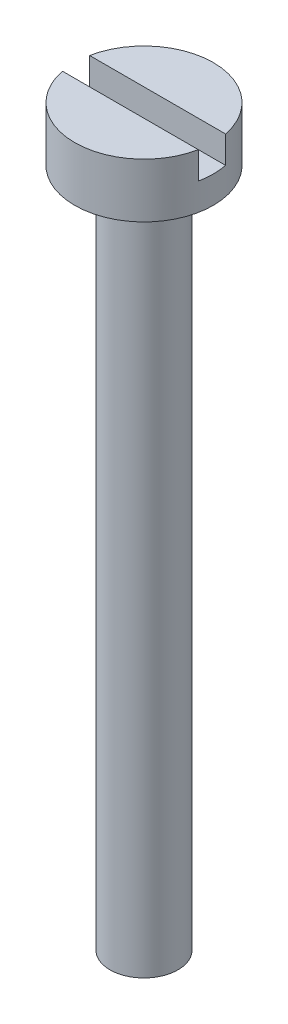
ISO-10303-21;
HEADER;
FILE_DESCRIPTION(('STEP AP214'),'2;1');
FILE_NAME('part.step','',(''),(''),'','','');
FILE_SCHEMA(('AUTOMOTIVE_DESIGN { 1 0 10303 214 1 1 1 1 }'));
ENDSEC;
DATA;
#1=APPLICATION_CONTEXT('core data for automotive mechanical design processes');
#2=APPLICATION_PROTOCOL_DEFINITION('international standard','automotive_design',2000,#1);
#3=PRODUCT_CONTEXT('',#1,'mechanical');
#4=PRODUCT('Part','Part','',(#3));
#5=PRODUCT_RELATED_PRODUCT_CATEGORY('part','',(#4));
#6=PRODUCT_DEFINITION_FORMATION('','',#4);
#7=PRODUCT_DEFINITION_CONTEXT('part definition',#1,'design');
#8=PRODUCT_DEFINITION('design','',#6,#7);
#9=PRODUCT_DEFINITION_SHAPE('','',#8);
#10=(LENGTH_UNIT() NAMED_UNIT(*) SI_UNIT(.MILLI.,.METRE.));
#11=(NAMED_UNIT(*) PLANE_ANGLE_UNIT() SI_UNIT($,.RADIAN.));
#12=(NAMED_UNIT(*) SI_UNIT($,.STERADIAN.) SOLID_ANGLE_UNIT());
#13=UNCERTAINTY_MEASURE_WITH_UNIT(LENGTH_MEASURE(1.E-05),#10,'distance_accuracy_value','');
#14=(GEOMETRIC_REPRESENTATION_CONTEXT(3) GLOBAL_UNCERTAINTY_ASSIGNED_CONTEXT((#13)) GLOBAL_UNIT_ASSIGNED_CONTEXT((#10,
#11,#12)) REPRESENTATION_CONTEXT('',''));
#15=CARTESIAN_POINT('',(0.,0.,0.));
#16=DIRECTION('',(0.,0.,1.));
#17=DIRECTION('',(1.,0.,0.));
#18=AXIS2_PLACEMENT_3D('',#15,#16,#17);
#19=CARTESIAN_POINT('',(0.,2.,0.));
#20=DIRECTION('',(0.,1.,0.));
#21=DIRECTION('',(0.,0.,1.));
#22=AXIS2_PLACEMENT_3D('',#19,#20,#21);
#23=PLANE('',#22);
#24=DIRECTION('',(1.,0.,0.));
#25=VECTOR('',#24,1.);
#26=CARTESIAN_POINT('',(0.,2.,0.5));
#27=LINE('',#26,#25);
#28=CARTESIAN_POINT('',(-2.50049995001,2.,0.5));
#29=VERTEX_POINT('',#28);
#30=CARTESIAN_POINT('',(2.50049995001,2.,0.5));
#31=VERTEX_POINT('',#30);
#32=EDGE_CURVE('E83',#29,#31,#27,.T.);
#33=ORIENTED_EDGE('',*,*,#32,.F.);
#34=CARTESIAN_POINT('',(0.,2.,0.));
#35=DIRECTION('',(0.,1.,0.));
#36=DIRECTION('',(0.,0.,1.));
#37=AXIS2_PLACEMENT_3D('',#34,#35,#36);
#38=CIRCLE('',#37,2.55);
#39=EDGE_CURVE('E93',#29,#31,#38,.T.);
#40=ORIENTED_EDGE('',*,*,#39,.T.);
#41=EDGE_LOOP('',(#33,#40));
#42=FACE_BOUND('',#41,.T.);
#43=ADVANCED_FACE('F35',(#42),#23,.T.);
#44=CARTESIAN_POINT('',(0.,2.,0.));
#45=DIRECTION('',(0.,-1.,0.));
#46=DIRECTION('',(0.,0.,-1.));
#47=AXIS2_PLACEMENT_3D('',#44,#45,#46);
#48=CYLINDRICAL_SURFACE('',#47,2.55);
#49=CARTESIAN_POINT('',(0.,1.,0.));
#50=DIRECTION('',(0.,-1.,0.));
#51=DIRECTION('',(0.,0.,-1.));
#52=AXIS2_PLACEMENT_3D('',#49,#50,#51);
#53=CIRCLE('',#52,2.55);
#54=CARTESIAN_POINT('',(2.50049995001,1.,-0.5));
#55=VERTEX_POINT('',#54);
#56=CARTESIAN_POINT('',(2.50049995001,1.,0.5));
#57=VERTEX_POINT('',#56);
#58=EDGE_CURVE('E11',#55,#57,#53,.T.);
#59=ORIENTED_EDGE('',*,*,#58,.T.);
#60=DIRECTION('',(0.,-1.,0.));
#61=VECTOR('',#60,1.);
#62=CARTESIAN_POINT('',(2.50049995001,2.,0.5));
#63=LINE('',#62,#61);
#64=EDGE_CURVE('E58',#57,#31,#63,.F.);
#65=ORIENTED_EDGE('',*,*,#64,.T.);
#66=ORIENTED_EDGE('',*,*,#39,.F.);
#67=DIRECTION('',(0.,-1.,0.));
#68=VECTOR('',#67,1.);
#69=CARTESIAN_POINT('',(-2.50049995001,2.,0.5));
#70=LINE('',#69,#68);
#71=CARTESIAN_POINT('',(-2.50049995001,1.,0.5));
#72=VERTEX_POINT('',#71);
#73=EDGE_CURVE('E105',#29,#72,#70,.T.);
#74=ORIENTED_EDGE('',*,*,#73,.T.);
#75=CARTESIAN_POINT('',(-2.50049995001,1.,-0.5));
#76=VERTEX_POINT('',#75);
#77=EDGE_CURVE('E39',#72,#76,#53,.T.);
#78=ORIENTED_EDGE('',*,*,#77,.T.);
#79=DIRECTION('',(0.,-1.,0.));
#80=VECTOR('',#79,1.);
#81=CARTESIAN_POINT('',(-2.50049995001,2.,-0.5));
#82=LINE('',#81,#80);
#83=CARTESIAN_POINT('',(-2.50049995001,2.,-0.5));
#84=VERTEX_POINT('',#83);
#85=EDGE_CURVE('E78',#76,#84,#82,.F.);
#86=ORIENTED_EDGE('',*,*,#85,.T.);
#87=CARTESIAN_POINT('',(2.50049995001,2.,-0.5));
#88=VERTEX_POINT('',#87);
#89=EDGE_CURVE('E84',#88,#84,#38,.T.);
#90=ORIENTED_EDGE('',*,*,#89,.F.);
#91=DIRECTION('',(0.,-1.,0.));
#92=VECTOR('',#91,1.);
#93=CARTESIAN_POINT('',(2.50049995001,2.,-0.5));
#94=LINE('',#93,#92);
#95=EDGE_CURVE('E50',#88,#55,#94,.T.);
#96=ORIENTED_EDGE('',*,*,#95,.T.);
#97=EDGE_LOOP('',(#59,#65,#66,#74,#78,#86,#90,#96));
#98=FACE_BOUND('',#97,.T.);
#99=CARTESIAN_POINT('',(0.,0.,0.));
#100=DIRECTION('',(0.,1.,0.));
#101=DIRECTION('',(0.,0.,1.));
#102=AXIS2_PLACEMENT_3D('',#99,#100,#101);
#103=CIRCLE('',#102,2.55);
#104=CARTESIAN_POINT('',(0.,0.,2.55));
#105=VERTEX_POINT('',#104);
#106=EDGE_CURVE('E96',#105,#105,#103,.T.);
#107=ORIENTED_EDGE('',*,*,#106,.T.);
#108=EDGE_LOOP('',(#107));
#109=FACE_BOUND('',#108,.T.);
#110=ADVANCED_FACE('F37',(#98,#109),#48,.T.);
#111=DIRECTION('',(-1.,0.,0.));
#112=VECTOR('',#111,1.);
#113=CARTESIAN_POINT('',(0.,2.,-0.5));
#114=LINE('',#113,#112);
#115=EDGE_CURVE('E75',#88,#84,#114,.T.);
#116=ORIENTED_EDGE('',*,*,#115,.F.);
#117=ORIENTED_EDGE('',*,*,#89,.T.);
#118=EDGE_LOOP('',(#116,#117));
#119=FACE_BOUND('',#118,.T.);
#120=ADVANCED_FACE('F92',(#119),#23,.T.);
#121=CARTESIAN_POINT('',(0.,0.,0.));
#122=DIRECTION('',(0.,1.,0.));
#123=DIRECTION('',(0.,0.,1.));
#124=AXIS2_PLACEMENT_3D('',#121,#122,#123);
#125=PLANE('',#124);
#126=CARTESIAN_POINT('',(0.,0.,0.));
#127=DIRECTION('',(0.,1.,0.));
#128=DIRECTION('',(0.,0.,1.));
#129=AXIS2_PLACEMENT_3D('',#126,#127,#128);
#130=CIRCLE('',#129,1.25);
#131=CARTESIAN_POINT('',(0.,0.,1.25));
#132=VERTEX_POINT('',#131);
#133=EDGE_CURVE('E99',#132,#132,#130,.T.);
#134=ORIENTED_EDGE('',*,*,#133,.T.);
#135=EDGE_LOOP('',(#134));
#136=FACE_BOUND('',#135,.T.);
#137=ORIENTED_EDGE('',*,*,#106,.F.);
#138=EDGE_LOOP('',(#137));
#139=FACE_BOUND('',#138,.T.);
#140=ADVANCED_FACE('F116',(#136,#139),#125,.F.);
#141=CARTESIAN_POINT('',(0.,-25.,0.));
#142=DIRECTION('',(0.,1.,0.));
#143=DIRECTION('',(0.,0.,1.));
#144=AXIS2_PLACEMENT_3D('',#141,#142,#143);
#145=CYLINDRICAL_SURFACE('',#144,1.25);
#146=CARTESIAN_POINT('',(0.,-25.,0.));
#147=DIRECTION('',(0.,1.,0.));
#148=DIRECTION('',(0.,0.,1.));
#149=AXIS2_PLACEMENT_3D('',#146,#147,#148);
#150=CIRCLE('',#149,1.25);
#151=CARTESIAN_POINT('',(0.,-25.,1.25));
#152=VERTEX_POINT('',#151);
#153=EDGE_CURVE('E102',#152,#152,#150,.T.);
#154=ORIENTED_EDGE('',*,*,#153,.T.);
#155=EDGE_LOOP('',(#154));
#156=FACE_BOUND('',#155,.T.);
#157=ORIENTED_EDGE('',*,*,#133,.F.);
#158=EDGE_LOOP('',(#157));
#159=FACE_BOUND('',#158,.T.);
#160=ADVANCED_FACE('F120',(#156,#159),#145,.T.);
#161=CARTESIAN_POINT('',(0.,-25.,0.));
#162=DIRECTION('',(0.,1.,0.));
#163=DIRECTION('',(0.,0.,1.));
#164=AXIS2_PLACEMENT_3D('',#161,#162,#163);
#165=PLANE('',#164);
#166=ORIENTED_EDGE('',*,*,#153,.F.);
#167=EDGE_LOOP('',(#166));
#168=FACE_BOUND('',#167,.T.);
#169=ADVANCED_FACE('F125',(#168),#165,.F.);
#170=CARTESIAN_POINT('',(0.,1.,0.));
#171=DIRECTION('',(0.,-1.,0.));
#172=DIRECTION('',(0.,0.,-1.));
#173=AXIS2_PLACEMENT_3D('',#170,#171,#172);
#174=PLANE('',#173);
#175=DIRECTION('',(-1.,0.,0.));
#176=VECTOR('',#175,1.);
#177=CARTESIAN_POINT('',(-3.,1.,-0.5));
#178=LINE('',#177,#176);
#179=EDGE_CURVE('E137',#55,#76,#178,.T.);
#180=ORIENTED_EDGE('',*,*,#179,.T.);
#181=ORIENTED_EDGE('',*,*,#77,.F.);
#182=DIRECTION('',(1.,0.,0.));
#183=VECTOR('',#182,1.);
#184=CARTESIAN_POINT('',(-3.,1.,0.5));
#185=LINE('',#184,#183);
#186=EDGE_CURVE('E90',#72,#57,#185,.T.);
#187=ORIENTED_EDGE('',*,*,#186,.T.);
#188=ORIENTED_EDGE('',*,*,#58,.F.);
#189=EDGE_LOOP('',(#180,#181,#187,#188));
#190=FACE_BOUND('',#189,.T.);
#191=ADVANCED_FACE('F139',(#190),#174,.F.);
#192=CARTESIAN_POINT('',(-3.,1.,0.5));
#193=DIRECTION('',(0.,0.,1.));
#194=DIRECTION('',(1.,0.,0.));
#195=AXIS2_PLACEMENT_3D('',#192,#193,#194);
#196=PLANE('',#195);
#197=ORIENTED_EDGE('',*,*,#32,.T.);
#198=ORIENTED_EDGE('',*,*,#64,.F.);
#199=ORIENTED_EDGE('',*,*,#186,.F.);
#200=ORIENTED_EDGE('',*,*,#73,.F.);
#201=EDGE_LOOP('',(#197,#198,#199,#200));
#202=FACE_BOUND('',#201,.T.);
#203=ADVANCED_FACE('F104',(#202),#196,.F.);
#204=CARTESIAN_POINT('',(-3.,1.,-0.5));
#205=DIRECTION('',(0.,0.,-1.));
#206=DIRECTION('',(-1.,0.,0.));
#207=AXIS2_PLACEMENT_3D('',#204,#205,#206);
#208=PLANE('',#207);
#209=ORIENTED_EDGE('',*,*,#115,.T.);
#210=ORIENTED_EDGE('',*,*,#85,.F.);
#211=ORIENTED_EDGE('',*,*,#179,.F.);
#212=ORIENTED_EDGE('',*,*,#95,.F.);
#213=EDGE_LOOP('',(#209,#210,#211,#212));
#214=FACE_BOUND('',#213,.T.);
#215=ADVANCED_FACE('F77',(#214),#208,.F.);
#216=CLOSED_SHELL('',(#43,#110,#120,#140,#160,#169,#191,#203,#215));
#217=MANIFOLD_SOLID_BREP('B2',#216);
#218=ADVANCED_BREP_SHAPE_REPRESENTATION('',(#18,#217),#14);
#219=SHAPE_DEFINITION_REPRESENTATION(#9,#218);
ENDSEC;
END-ISO-10303-21;
